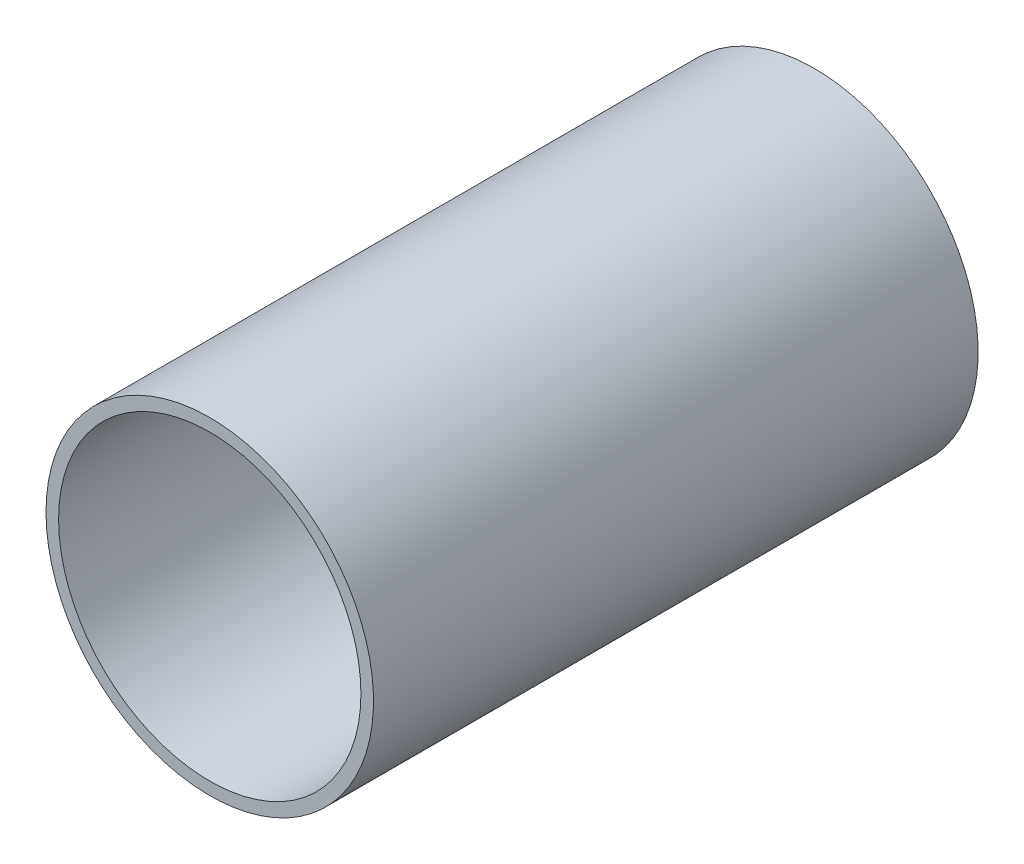
ISO-10303-21;
HEADER;
FILE_DESCRIPTION(('STEP AP214'),'2;1');
FILE_NAME('part.step','',(''),(''),'','','');
FILE_SCHEMA(('AUTOMOTIVE_DESIGN { 1 0 10303 214 1 1 1 1 }'));
ENDSEC;
DATA;
#1=APPLICATION_CONTEXT('core data for automotive mechanical design processes');
#2=APPLICATION_PROTOCOL_DEFINITION('international standard','automotive_design',2000,#1);
#3=PRODUCT_CONTEXT('',#1,'mechanical');
#4=PRODUCT('Part','Part','',(#3));
#5=PRODUCT_RELATED_PRODUCT_CATEGORY('part','',(#4));
#6=PRODUCT_DEFINITION_FORMATION('','',#4);
#7=PRODUCT_DEFINITION_CONTEXT('part definition',#1,'design');
#8=PRODUCT_DEFINITION('design','',#6,#7);
#9=PRODUCT_DEFINITION_SHAPE('','',#8);
#10=(LENGTH_UNIT() NAMED_UNIT(*) SI_UNIT(.MILLI.,.METRE.));
#11=(NAMED_UNIT(*) PLANE_ANGLE_UNIT() SI_UNIT($,.RADIAN.));
#12=(NAMED_UNIT(*) SI_UNIT($,.STERADIAN.) SOLID_ANGLE_UNIT());
#13=UNCERTAINTY_MEASURE_WITH_UNIT(LENGTH_MEASURE(1.E-05),#10,'distance_accuracy_value','');
#14=(GEOMETRIC_REPRESENTATION_CONTEXT(3) GLOBAL_UNCERTAINTY_ASSIGNED_CONTEXT((#13)) GLOBAL_UNIT_ASSIGNED_CONTEXT((#10,
#11,#12)) REPRESENTATION_CONTEXT('',''));
#15=CARTESIAN_POINT('',(0.,0.,0.));
#16=DIRECTION('',(0.,0.,1.));
#17=DIRECTION('',(1.,0.,0.));
#18=AXIS2_PLACEMENT_3D('',#15,#16,#17);
#19=CARTESIAN_POINT('',(0.,0.,304.8));
#20=DIRECTION('',(0.,0.,1.));
#21=DIRECTION('',(1.,0.,0.));
#22=AXIS2_PLACEMENT_3D('',#19,#20,#21);
#23=PLANE('',#22);
#24=CARTESIAN_POINT('',(0.,0.,304.8));
#25=DIRECTION('',(0.,0.,1.));
#26=DIRECTION('',(1.,0.,0.));
#27=AXIS2_PLACEMENT_3D('',#24,#25,#26);
#28=CIRCLE('',#27,82.55);
#29=CARTESIAN_POINT('',(-82.55,0.,304.8));
#30=VERTEX_POINT('',#29);
#31=EDGE_CURVE('E10',#30,#30,#28,.T.);
#32=ORIENTED_EDGE('',*,*,#31,.T.);
#33=EDGE_LOOP('',(#32));
#34=FACE_BOUND('',#33,.T.);
#35=CARTESIAN_POINT('',(0.,0.,304.8));
#36=DIRECTION('',(0.,0.,1.));
#37=DIRECTION('',(1.,0.,0.));
#38=AXIS2_PLACEMENT_3D('',#35,#36,#37);
#39=CIRCLE('',#38,76.2);
#40=CARTESIAN_POINT('',(-76.2,0.,304.8));
#41=VERTEX_POINT('',#40);
#42=EDGE_CURVE('E50',#41,#41,#39,.T.);
#43=ORIENTED_EDGE('',*,*,#42,.F.);
#44=EDGE_LOOP('',(#43));
#45=FACE_BOUND('',#44,.T.);
#46=ADVANCED_FACE('F37',(#34,#45),#23,.T.);
#47=CARTESIAN_POINT('',(0.,0.,0.));
#48=DIRECTION('',(0.,0.,1.));
#49=DIRECTION('',(1.,0.,0.));
#50=AXIS2_PLACEMENT_3D('',#47,#48,#49);
#51=PLANE('',#50);
#52=CARTESIAN_POINT('',(0.,0.,0.));
#53=DIRECTION('',(0.,0.,1.));
#54=DIRECTION('',(1.,0.,0.));
#55=AXIS2_PLACEMENT_3D('',#52,#53,#54);
#56=CIRCLE('',#55,82.55);
#57=CARTESIAN_POINT('',(-82.55,0.,0.));
#58=VERTEX_POINT('',#57);
#59=EDGE_CURVE('E41',#58,#58,#56,.T.);
#60=ORIENTED_EDGE('',*,*,#59,.F.);
#61=EDGE_LOOP('',(#60));
#62=FACE_BOUND('',#61,.T.);
#63=CARTESIAN_POINT('',(0.,0.,0.));
#64=DIRECTION('',(0.,0.,1.));
#65=DIRECTION('',(1.,0.,0.));
#66=AXIS2_PLACEMENT_3D('',#63,#64,#65);
#67=CIRCLE('',#66,76.2);
#68=CARTESIAN_POINT('',(-76.2,0.,0.));
#69=VERTEX_POINT('',#68);
#70=EDGE_CURVE('E52',#69,#69,#67,.T.);
#71=ORIENTED_EDGE('',*,*,#70,.T.);
#72=EDGE_LOOP('',(#71));
#73=FACE_BOUND('',#72,.T.);
#74=ADVANCED_FACE('F64',(#62,#73),#51,.F.);
#75=CARTESIAN_POINT('',(0.,0.,304.8));
#76=DIRECTION('',(0.,0.,-1.));
#77=DIRECTION('',(-1.,0.,0.));
#78=AXIS2_PLACEMENT_3D('',#75,#76,#77);
#79=CYLINDRICAL_SURFACE('',#78,82.55);
#80=CARTESIAN_POINT('',(-82.55,0.,304.8));
#81=CARTESIAN_POINT('',(-82.55,0.,301.625));
#82=CARTESIAN_POINT('',(-82.55,0.,298.45));
#83=CARTESIAN_POINT('',(-82.55,0.,292.1));
#84=CARTESIAN_POINT('',(-82.55,0.,288.925));
#85=CARTESIAN_POINT('',(-82.55,0.,282.575));
#86=CARTESIAN_POINT('',(-82.55,0.,279.4));
#87=CARTESIAN_POINT('',(-82.55,0.,273.05));
#88=CARTESIAN_POINT('',(-82.55,0.,269.875));
#89=CARTESIAN_POINT('',(-82.55,0.,263.525));
#90=CARTESIAN_POINT('',(-82.55,0.,260.35));
#91=CARTESIAN_POINT('',(-82.55,0.,254.));
#92=CARTESIAN_POINT('',(-82.55,0.,250.825));
#93=CARTESIAN_POINT('',(-82.55,0.,244.475));
#94=CARTESIAN_POINT('',(-82.55,0.,241.3));
#95=CARTESIAN_POINT('',(-82.55,0.,234.95));
#96=CARTESIAN_POINT('',(-82.55,0.,231.775));
#97=CARTESIAN_POINT('',(-82.55,0.,225.425));
#98=CARTESIAN_POINT('',(-82.55,0.,222.25));
#99=CARTESIAN_POINT('',(-82.55,0.,215.9));
#100=CARTESIAN_POINT('',(-82.55,0.,212.725));
#101=CARTESIAN_POINT('',(-82.55,0.,206.375));
#102=CARTESIAN_POINT('',(-82.55,0.,203.2));
#103=CARTESIAN_POINT('',(-82.55,0.,196.85));
#104=CARTESIAN_POINT('',(-82.55,0.,193.675));
#105=CARTESIAN_POINT('',(-82.55,0.,187.325));
#106=CARTESIAN_POINT('',(-82.55,0.,184.15));
#107=CARTESIAN_POINT('',(-82.55,0.,177.8));
#108=CARTESIAN_POINT('',(-82.55,0.,174.625));
#109=CARTESIAN_POINT('',(-82.55,0.,168.275));
#110=CARTESIAN_POINT('',(-82.55,0.,165.1));
#111=CARTESIAN_POINT('',(-82.55,0.,158.75));
#112=CARTESIAN_POINT('',(-82.55,0.,155.575));
#113=CARTESIAN_POINT('',(-82.55,0.,149.225));
#114=CARTESIAN_POINT('',(-82.55,0.,146.05));
#115=CARTESIAN_POINT('',(-82.55,0.,139.7));
#116=CARTESIAN_POINT('',(-82.55,0.,136.525));
#117=CARTESIAN_POINT('',(-82.55,0.,130.175));
#118=CARTESIAN_POINT('',(-82.55,0.,127.));
#119=CARTESIAN_POINT('',(-82.55,0.,120.65));
#120=CARTESIAN_POINT('',(-82.55,0.,117.475));
#121=CARTESIAN_POINT('',(-82.55,0.,111.125));
#122=CARTESIAN_POINT('',(-82.55,0.,107.95));
#123=CARTESIAN_POINT('',(-82.55,0.,101.6));
#124=CARTESIAN_POINT('',(-82.55,0.,98.425));
#125=CARTESIAN_POINT('',(-82.55,0.,92.075));
#126=CARTESIAN_POINT('',(-82.55,0.,88.9));
#127=CARTESIAN_POINT('',(-82.55,0.,82.55));
#128=CARTESIAN_POINT('',(-82.55,0.,79.375));
#129=CARTESIAN_POINT('',(-82.55,0.,73.025));
#130=CARTESIAN_POINT('',(-82.55,0.,69.85));
#131=CARTESIAN_POINT('',(-82.55,0.,63.5));
#132=CARTESIAN_POINT('',(-82.55,0.,60.325));
#133=CARTESIAN_POINT('',(-82.55,0.,53.975));
#134=CARTESIAN_POINT('',(-82.55,0.,50.8));
#135=CARTESIAN_POINT('',(-82.55,0.,44.45));
#136=CARTESIAN_POINT('',(-82.55,0.,41.275));
#137=CARTESIAN_POINT('',(-82.55,0.,34.925));
#138=CARTESIAN_POINT('',(-82.55,0.,31.75));
#139=CARTESIAN_POINT('',(-82.55,0.,25.4));
#140=CARTESIAN_POINT('',(-82.55,0.,22.225));
#141=CARTESIAN_POINT('',(-82.55,0.,15.875));
#142=CARTESIAN_POINT('',(-82.55,0.,12.7));
#143=CARTESIAN_POINT('',(-82.55,0.,6.35));
#144=CARTESIAN_POINT('',(-82.55,0.,3.175));
#145=CARTESIAN_POINT('',(-82.55,0.,0.));
#146=B_SPLINE_CURVE_WITH_KNOTS('',3,(#80,#81,#82,#83,#84,#85,#86,#87,#88,#89,#90,#91,#92,#93,
#94,#95,#96,#97,#98,#99,#100,#101,#102,#103,#104,#105,#106,#107,#108,#109,#110,#111,#112,#113,
#114,#115,#116,#117,#118,#119,#120,#121,#122,#123,#124,#125,#126,#127,#128,#129,#130,#131,#132,
#133,#134,#135,#136,#137,#138,#139,#140,#141,#142,#143,#144,#145),.UNSPECIFIED.,.F.,.F.,(4,2,2,
2,2,2,2,2,2,2,2,2,2,2,2,2,2,2,2,2,2,2,2,2,2,2,2,2,2,2,2,2,4),(0.,9.52499999999995,19.05,28.575,
38.1,47.625,57.15,66.675,76.2,85.725,95.2499999999999,104.775,114.3,123.825,133.35,142.875,
152.4,161.925,171.45,180.975,190.5,200.025,209.55,219.075,228.6,238.125,247.65,257.175,266.7,
276.225,285.75,295.275,304.8),.UNSPECIFIED.);
#147=EDGE_CURVE('BSEAM39',#30,#58,#146,.T.);
#148=ORIENTED_EDGE('',*,*,#31,.F.);
#149=ORIENTED_EDGE('',*,*,#59,.T.);
#150=ORIENTED_EDGE('',*,*,#147,.T.);
#151=ORIENTED_EDGE('',*,*,#147,.F.);
#152=EDGE_LOOP('',(#148,#150,#149,#151));
#153=FACE_BOUND('',#152,.T.);
#154=ADVANCED_FACE('F39',(#153),#79,.T.);
#155=CARTESIAN_POINT('',(0.,0.,304.8));
#156=DIRECTION('',(0.,0.,-1.));
#157=DIRECTION('',(-1.,0.,0.));
#158=AXIS2_PLACEMENT_3D('',#155,#156,#157);
#159=CYLINDRICAL_SURFACE('',#158,76.2);
#160=CARTESIAN_POINT('',(-76.2,0.,304.8));
#161=CARTESIAN_POINT('',(-76.2,0.,301.625));
#162=CARTESIAN_POINT('',(-76.2,0.,298.45));
#163=CARTESIAN_POINT('',(-76.2,0.,292.1));
#164=CARTESIAN_POINT('',(-76.2,0.,288.925));
#165=CARTESIAN_POINT('',(-76.2,0.,282.575));
#166=CARTESIAN_POINT('',(-76.2,0.,279.4));
#167=CARTESIAN_POINT('',(-76.2,0.,273.05));
#168=CARTESIAN_POINT('',(-76.2,0.,269.875));
#169=CARTESIAN_POINT('',(-76.2,0.,263.525));
#170=CARTESIAN_POINT('',(-76.2,0.,260.35));
#171=CARTESIAN_POINT('',(-76.2,0.,254.));
#172=CARTESIAN_POINT('',(-76.2,0.,250.825));
#173=CARTESIAN_POINT('',(-76.2,0.,244.475));
#174=CARTESIAN_POINT('',(-76.2,0.,241.3));
#175=CARTESIAN_POINT('',(-76.2,0.,234.95));
#176=CARTESIAN_POINT('',(-76.2,0.,231.775));
#177=CARTESIAN_POINT('',(-76.2,0.,225.425));
#178=CARTESIAN_POINT('',(-76.2,0.,222.25));
#179=CARTESIAN_POINT('',(-76.2,0.,215.9));
#180=CARTESIAN_POINT('',(-76.2,0.,212.725));
#181=CARTESIAN_POINT('',(-76.2,0.,206.375));
#182=CARTESIAN_POINT('',(-76.2,0.,203.2));
#183=CARTESIAN_POINT('',(-76.2,0.,196.85));
#184=CARTESIAN_POINT('',(-76.2,0.,193.675));
#185=CARTESIAN_POINT('',(-76.2,0.,187.325));
#186=CARTESIAN_POINT('',(-76.2,0.,184.15));
#187=CARTESIAN_POINT('',(-76.2,0.,177.8));
#188=CARTESIAN_POINT('',(-76.2,0.,174.625));
#189=CARTESIAN_POINT('',(-76.2,0.,168.275));
#190=CARTESIAN_POINT('',(-76.2,0.,165.1));
#191=CARTESIAN_POINT('',(-76.2,0.,158.75));
#192=CARTESIAN_POINT('',(-76.2,0.,155.575));
#193=CARTESIAN_POINT('',(-76.2,0.,149.225));
#194=CARTESIAN_POINT('',(-76.2,0.,146.05));
#195=CARTESIAN_POINT('',(-76.2,0.,139.7));
#196=CARTESIAN_POINT('',(-76.2,0.,136.525));
#197=CARTESIAN_POINT('',(-76.2,0.,130.175));
#198=CARTESIAN_POINT('',(-76.2,0.,127.));
#199=CARTESIAN_POINT('',(-76.2,0.,120.65));
#200=CARTESIAN_POINT('',(-76.2,0.,117.475));
#201=CARTESIAN_POINT('',(-76.2,0.,111.125));
#202=CARTESIAN_POINT('',(-76.2,0.,107.95));
#203=CARTESIAN_POINT('',(-76.2,0.,101.6));
#204=CARTESIAN_POINT('',(-76.2,0.,98.425));
#205=CARTESIAN_POINT('',(-76.2,0.,92.075));
#206=CARTESIAN_POINT('',(-76.2,0.,88.9));
#207=CARTESIAN_POINT('',(-76.2,0.,82.55));
#208=CARTESIAN_POINT('',(-76.2,0.,79.375));
#209=CARTESIAN_POINT('',(-76.2,0.,73.025));
#210=CARTESIAN_POINT('',(-76.2,0.,69.85));
#211=CARTESIAN_POINT('',(-76.2,0.,63.5));
#212=CARTESIAN_POINT('',(-76.2,0.,60.325));
#213=CARTESIAN_POINT('',(-76.2,0.,53.975));
#214=CARTESIAN_POINT('',(-76.2,0.,50.8));
#215=CARTESIAN_POINT('',(-76.2,0.,44.45));
#216=CARTESIAN_POINT('',(-76.2,0.,41.275));
#217=CARTESIAN_POINT('',(-76.2,0.,34.925));
#218=CARTESIAN_POINT('',(-76.2,0.,31.75));
#219=CARTESIAN_POINT('',(-76.2,0.,25.4));
#220=CARTESIAN_POINT('',(-76.2,0.,22.225));
#221=CARTESIAN_POINT('',(-76.2,0.,15.875));
#222=CARTESIAN_POINT('',(-76.2,0.,12.7));
#223=CARTESIAN_POINT('',(-76.2,0.,6.35));
#224=CARTESIAN_POINT('',(-76.2,0.,3.175));
#225=CARTESIAN_POINT('',(-76.2,0.,0.));
#226=B_SPLINE_CURVE_WITH_KNOTS('',3,(#160,#161,#162,#163,#164,#165,#166,#167,#168,#169,#170,
#171,#172,#173,#174,#175,#176,#177,#178,#179,#180,#181,#182,#183,#184,#185,#186,#187,#188,#189,
#190,#191,#192,#193,#194,#195,#196,#197,#198,#199,#200,#201,#202,#203,#204,#205,#206,#207,#208,
#209,#210,#211,#212,#213,#214,#215,#216,#217,#218,#219,#220,#221,#222,#223,#224,#225),
.UNSPECIFIED.,.F.,.F.,(4,2,2,2,2,2,2,2,2,2,2,2,2,2,2,2,2,2,2,2,2,2,2,2,2,2,2,2,2,2,2,2,4),(0.,
9.52500000000001,19.05,28.575,38.1,47.625,57.15,66.675,76.2,85.7250000000001,95.2500000000001,
104.775,114.3,123.825,133.35,142.875,152.4,161.925,171.45,180.975,190.5,200.025,209.55,219.075,
228.6,238.125,247.65,257.175,266.7,276.225,285.75,295.275,304.8),.UNSPECIFIED.);
#227=EDGE_CURVE('BSEAM60',#41,#69,#226,.T.);
#228=ORIENTED_EDGE('',*,*,#42,.T.);
#229=ORIENTED_EDGE('',*,*,#70,.F.);
#230=ORIENTED_EDGE('',*,*,#227,.T.);
#231=ORIENTED_EDGE('',*,*,#227,.F.);
#232=EDGE_LOOP('',(#228,#230,#229,#231));
#233=FACE_BOUND('',#232,.T.);
#234=ADVANCED_FACE('F60',(#233),#159,.F.);
#235=CLOSED_SHELL('',(#46,#74,#154,#234));
#236=MANIFOLD_SOLID_BREP('B2',#235);
#237=ADVANCED_BREP_SHAPE_REPRESENTATION('',(#18,#236),#14);
#238=SHAPE_DEFINITION_REPRESENTATION(#9,#237);
ENDSEC;
END-ISO-10303-21;
